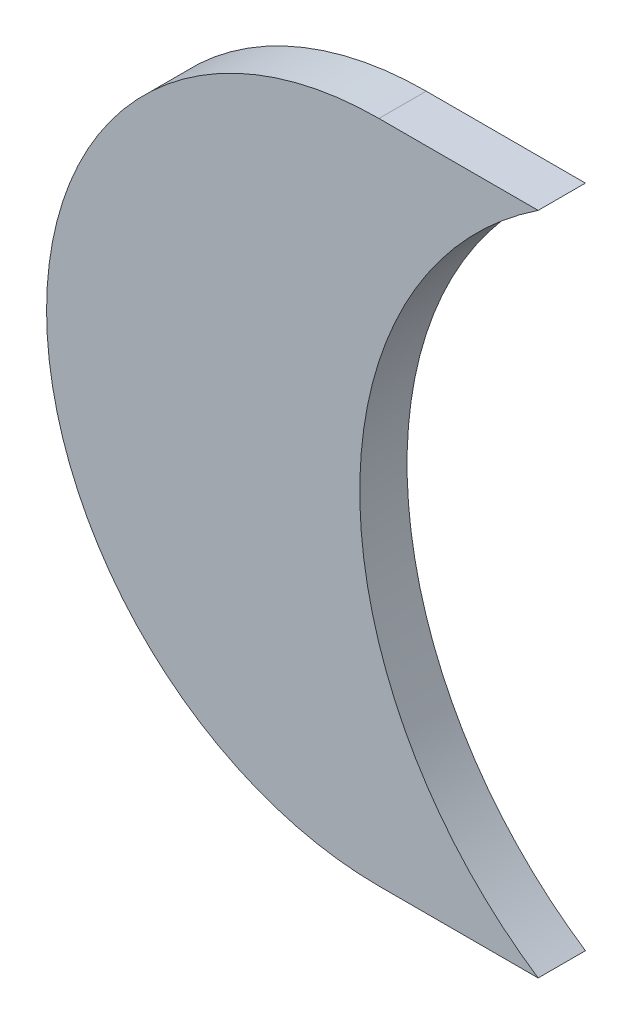
ISO-10303-21;
HEADER;
FILE_DESCRIPTION(('STEP AP214'),'2;1');
FILE_NAME('part.step','',(''),(''),'','','');
FILE_SCHEMA(('AUTOMOTIVE_DESIGN { 1 0 10303 214 1 1 1 1 }'));
ENDSEC;
DATA;
#1=APPLICATION_CONTEXT('core data for automotive mechanical design processes');
#2=APPLICATION_PROTOCOL_DEFINITION('international standard','automotive_design',2000,#1);
#3=PRODUCT_CONTEXT('',#1,'mechanical');
#4=PRODUCT('Part','Part','',(#3));
#5=PRODUCT_RELATED_PRODUCT_CATEGORY('part','',(#4));
#6=PRODUCT_DEFINITION_FORMATION('','',#4);
#7=PRODUCT_DEFINITION_CONTEXT('part definition',#1,'design');
#8=PRODUCT_DEFINITION('design','',#6,#7);
#9=PRODUCT_DEFINITION_SHAPE('','',#8);
#10=(LENGTH_UNIT() NAMED_UNIT(*) SI_UNIT(.MILLI.,.METRE.));
#11=(NAMED_UNIT(*) PLANE_ANGLE_UNIT() SI_UNIT($,.RADIAN.));
#12=(NAMED_UNIT(*) SI_UNIT($,.STERADIAN.) SOLID_ANGLE_UNIT());
#13=UNCERTAINTY_MEASURE_WITH_UNIT(LENGTH_MEASURE(1.E-05),#10,'distance_accuracy_value','');
#14=(GEOMETRIC_REPRESENTATION_CONTEXT(3) GLOBAL_UNCERTAINTY_ASSIGNED_CONTEXT((#13)) GLOBAL_UNIT_ASSIGNED_CONTEXT((#10,
#11,#12)) REPRESENTATION_CONTEXT('',''));
#15=CARTESIAN_POINT('',(0.,0.,0.));
#16=DIRECTION('',(0.,0.,1.));
#17=DIRECTION('',(1.,0.,0.));
#18=AXIS2_PLACEMENT_3D('',#15,#16,#17);
#19=CARTESIAN_POINT('',(97.11443874,112.25000156,0.));
#20=DIRECTION('',(0.,1.,0.));
#21=DIRECTION('',(1.,0.,0.));
#22=AXIS2_PLACEMENT_3D('',#19,#20,#21);
#23=PLANE('',#22);
#24=DIRECTION('',(1.,0.,0.));
#25=VECTOR('',#24,1.);
#26=CARTESIAN_POINT('',(97.11443874,112.25000156,0.03556));
#27=LINE('',#26,#25);
#28=CARTESIAN_POINT('',(97.11443874,112.25000156,0.03556));
#29=VERTEX_POINT('',#28);
#30=CARTESIAN_POINT('',(97.2341774921447,112.25000156,0.03556));
#31=VERTEX_POINT('',#30);
#32=EDGE_CURVE('E11',#29,#31,#27,.T.);
#33=ORIENTED_EDGE('',*,*,#32,.F.);
#34=DIRECTION('',(0.,0.,1.));
#35=VECTOR('',#34,1.);
#36=CARTESIAN_POINT('',(97.11443874,112.25000156,0.));
#37=LINE('',#36,#35);
#38=CARTESIAN_POINT('',(97.11443874,112.25000156,0.));
#39=VERTEX_POINT('',#38);
#40=EDGE_CURVE('E24',#39,#29,#37,.T.);
#41=ORIENTED_EDGE('',*,*,#40,.F.);
#42=DIRECTION('',(1.,0.,0.));
#43=VECTOR('',#42,1.);
#44=CARTESIAN_POINT('',(97.11443874,112.25000156,0.));
#45=LINE('',#44,#43);
#46=CARTESIAN_POINT('',(97.2341774921447,112.25000156,0.));
#47=VERTEX_POINT('',#46);
#48=EDGE_CURVE('E75',#39,#47,#45,.T.);
#49=ORIENTED_EDGE('',*,*,#48,.T.);
#50=DIRECTION('',(0.,0.,1.));
#51=VECTOR('',#50,1.);
#52=CARTESIAN_POINT('',(97.2341774921447,112.25000156,0.));
#53=LINE('',#52,#51);
#54=EDGE_CURVE('E37',#47,#31,#53,.T.);
#55=ORIENTED_EDGE('',*,*,#54,.T.);
#56=EDGE_LOOP('',(#33,#41,#49,#55));
#57=FACE_BOUND('',#56,.T.);
#58=ADVANCED_FACE('F17',(#57),#23,.F.);
#59=CARTESIAN_POINT('',(97.4000084,112.50000106,0.));
#60=DIRECTION('',(0.,0.,-1.));
#61=DIRECTION('',(1.,0.,0.));
#62=AXIS2_PLACEMENT_3D('',#59,#60,#61);
#63=CYLINDRICAL_SURFACE('',#62,0.2999994);
#64=DIRECTION('',(0.,0.,1.));
#65=VECTOR('',#64,1.);
#66=CARTESIAN_POINT('',(97.2341774921447,112.75000056,0.));
#67=LINE('',#66,#65);
#68=CARTESIAN_POINT('',(97.2341774921447,112.75000056,0.));
#69=VERTEX_POINT('',#68);
#70=CARTESIAN_POINT('',(97.2341774921447,112.75000056,0.03556));
#71=VERTEX_POINT('',#70);
#72=EDGE_CURVE('E67',#69,#71,#67,.T.);
#73=ORIENTED_EDGE('',*,*,#72,.T.);
#74=CARTESIAN_POINT('',(97.4000084,112.50000106,0.03556));
#75=DIRECTION('',(0.,0.,1.));
#76=DIRECTION('',(1.,0.,0.));
#77=AXIS2_PLACEMENT_3D('',#74,#75,#76);
#78=CIRCLE('',#77,0.2999994);
#79=EDGE_CURVE('E82',#71,#31,#78,.T.);
#80=ORIENTED_EDGE('',*,*,#79,.T.);
#81=ORIENTED_EDGE('',*,*,#54,.F.);
#82=CARTESIAN_POINT('',(97.4000084,112.50000106,0.));
#83=DIRECTION('',(0.,0.,1.));
#84=DIRECTION('',(1.,0.,0.));
#85=AXIS2_PLACEMENT_3D('',#82,#83,#84);
#86=CIRCLE('',#85,0.2999994);
#87=EDGE_CURVE('E80',#69,#47,#86,.T.);
#88=ORIENTED_EDGE('',*,*,#87,.F.);
#89=EDGE_LOOP('',(#73,#80,#81,#88));
#90=FACE_BOUND('',#89,.T.);
#91=ADVANCED_FACE('F88',(#90),#63,.F.);
#92=CARTESIAN_POINT('',(97.2341774921448,112.75000056,0.));
#93=DIRECTION('',(0.,-1.,0.));
#94=DIRECTION('',(-1.,0.,0.));
#95=AXIS2_PLACEMENT_3D('',#92,#93,#94);
#96=PLANE('',#95);
#97=DIRECTION('',(-1.,0.,0.));
#98=VECTOR('',#97,1.);
#99=CARTESIAN_POINT('',(97.4000084,112.75000056,0.03556));
#100=LINE('',#99,#98);
#101=CARTESIAN_POINT('',(97.11443874,112.75000056,0.03556));
#102=VERTEX_POINT('',#101);
#103=EDGE_CURVE('E71',#71,#102,#100,.T.);
#104=ORIENTED_EDGE('',*,*,#103,.F.);
#105=ORIENTED_EDGE('',*,*,#72,.F.);
#106=DIRECTION('',(-1.,0.,0.));
#107=VECTOR('',#106,1.);
#108=CARTESIAN_POINT('',(97.4000084,112.75000056,0.));
#109=LINE('',#108,#107);
#110=CARTESIAN_POINT('',(97.11443874,112.75000056,0.));
#111=VERTEX_POINT('',#110);
#112=EDGE_CURVE('E63',#69,#111,#109,.T.);
#113=ORIENTED_EDGE('',*,*,#112,.T.);
#114=DIRECTION('',(0.,0.,1.));
#115=VECTOR('',#114,1.);
#116=CARTESIAN_POINT('',(97.11443874,112.75000056,0.));
#117=LINE('',#116,#115);
#118=EDGE_CURVE('E53',#111,#102,#117,.T.);
#119=ORIENTED_EDGE('',*,*,#118,.T.);
#120=EDGE_LOOP('',(#104,#105,#113,#119));
#121=FACE_BOUND('',#120,.T.);
#122=ADVANCED_FACE('F66',(#121),#96,.F.);
#123=CARTESIAN_POINT('',(97.11443874,112.50000106,0.));
#124=DIRECTION('',(0.,0.,-1.));
#125=DIRECTION('',(0.,1.,0.));
#126=AXIS2_PLACEMENT_3D('',#123,#124,#125);
#127=CYLINDRICAL_SURFACE('',#126,0.249999500000001);
#128=CARTESIAN_POINT('',(97.11443874,112.50000106,0.03556));
#129=DIRECTION('',(0.,0.,1.));
#130=DIRECTION('',(0.,1.,0.));
#131=AXIS2_PLACEMENT_3D('',#128,#129,#130);
#132=CIRCLE('',#131,0.249999500000001);
#133=EDGE_CURVE('E59',#102,#29,#132,.T.);
#134=ORIENTED_EDGE('',*,*,#133,.F.);
#135=ORIENTED_EDGE('',*,*,#118,.F.);
#136=CARTESIAN_POINT('',(97.11443874,112.50000106,0.));
#137=DIRECTION('',(0.,0.,1.));
#138=DIRECTION('',(0.,1.,0.));
#139=AXIS2_PLACEMENT_3D('',#136,#137,#138);
#140=CIRCLE('',#139,0.249999500000001);
#141=EDGE_CURVE('E57',#111,#39,#140,.T.);
#142=ORIENTED_EDGE('',*,*,#141,.T.);
#143=ORIENTED_EDGE('',*,*,#40,.T.);
#144=EDGE_LOOP('',(#134,#135,#142,#143));
#145=FACE_BOUND('',#144,.T.);
#146=ADVANCED_FACE('F55',(#145),#127,.T.);
#147=CARTESIAN_POINT('',(97.11443874,112.25000156,0.));
#148=DIRECTION('',(0.,0.,-1.));
#149=DIRECTION('',(-1.,0.,0.));
#150=AXIS2_PLACEMENT_3D('',#147,#148,#149);
#151=PLANE('',#150);
#152=ORIENTED_EDGE('',*,*,#48,.F.);
#153=ORIENTED_EDGE('',*,*,#141,.F.);
#154=ORIENTED_EDGE('',*,*,#112,.F.);
#155=ORIENTED_EDGE('',*,*,#87,.T.);
#156=EDGE_LOOP('',(#152,#153,#154,#155));
#157=FACE_BOUND('',#156,.T.);
#158=ADVANCED_FACE('F74',(#157),#151,.T.);
#159=CARTESIAN_POINT('',(97.11443874,112.25000156,0.03556));
#160=DIRECTION('',(0.,0.,-1.));
#161=DIRECTION('',(-1.,0.,0.));
#162=AXIS2_PLACEMENT_3D('',#159,#160,#161);
#163=PLANE('',#162);
#164=ORIENTED_EDGE('',*,*,#133,.T.);
#165=ORIENTED_EDGE('',*,*,#32,.T.);
#166=ORIENTED_EDGE('',*,*,#79,.F.);
#167=ORIENTED_EDGE('',*,*,#103,.T.);
#168=EDGE_LOOP('',(#164,#165,#166,#167));
#169=FACE_BOUND('',#168,.T.);
#170=ADVANCED_FACE('F91',(#169),#163,.F.);
#171=CLOSED_SHELL('',(#58,#91,#122,#146,#158,#170));
#172=MANIFOLD_SOLID_BREP('B1',#171);
#173=ADVANCED_BREP_SHAPE_REPRESENTATION('',(#18,#172),#14);
#174=SHAPE_DEFINITION_REPRESENTATION(#9,#173);
ENDSEC;
END-ISO-10303-21;
